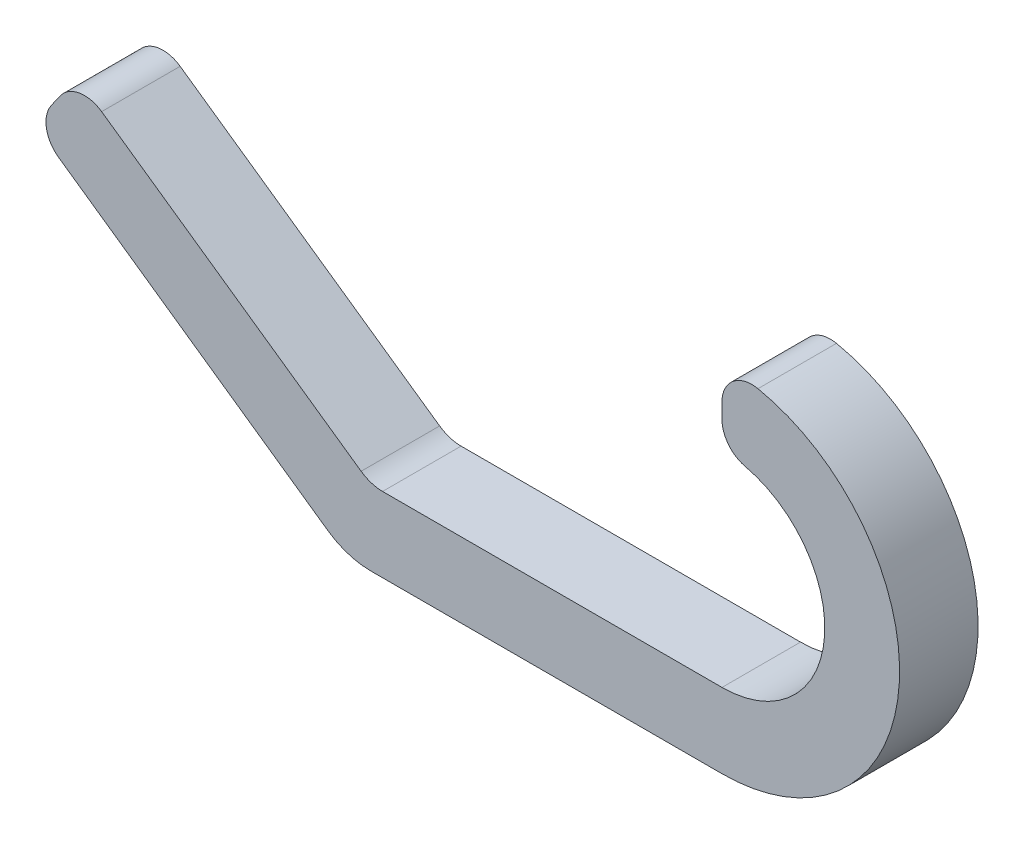
ISO-10303-21;
HEADER;
FILE_DESCRIPTION(('STEP AP214'),'2;1');
FILE_NAME('part.step','',(''),(''),'','','');
FILE_SCHEMA(('AUTOMOTIVE_DESIGN { 1 0 10303 214 1 1 1 1 }'));
ENDSEC;
DATA;
#1=APPLICATION_CONTEXT('core data for automotive mechanical design processes');
#2=APPLICATION_PROTOCOL_DEFINITION('international standard','automotive_design',2000,#1);
#3=PRODUCT_CONTEXT('',#1,'mechanical');
#4=PRODUCT('Part','Part','',(#3));
#5=PRODUCT_RELATED_PRODUCT_CATEGORY('part','',(#4));
#6=PRODUCT_DEFINITION_FORMATION('','',#4);
#7=PRODUCT_DEFINITION_CONTEXT('part definition',#1,'design');
#8=PRODUCT_DEFINITION('design','',#6,#7);
#9=PRODUCT_DEFINITION_SHAPE('','',#8);
#10=(LENGTH_UNIT() NAMED_UNIT(*) SI_UNIT(.MILLI.,.METRE.));
#11=(NAMED_UNIT(*) PLANE_ANGLE_UNIT() SI_UNIT($,.RADIAN.));
#12=(NAMED_UNIT(*) SI_UNIT($,.STERADIAN.) SOLID_ANGLE_UNIT());
#13=UNCERTAINTY_MEASURE_WITH_UNIT(LENGTH_MEASURE(1.E-05),#10,'distance_accuracy_value','');
#14=(GEOMETRIC_REPRESENTATION_CONTEXT(3) GLOBAL_UNCERTAINTY_ASSIGNED_CONTEXT((#13)) GLOBAL_UNIT_ASSIGNED_CONTEXT((#10,
#11,#12)) REPRESENTATION_CONTEXT('',''));
#15=CARTESIAN_POINT('',(0.,0.,0.));
#16=DIRECTION('',(0.,0.,1.));
#17=DIRECTION('',(1.,0.,0.));
#18=AXIS2_PLACEMENT_3D('',#15,#16,#17);
#19=CARTESIAN_POINT('',(93.9518596291826,27.5,21.));
#20=DIRECTION('',(0.,0.,-1.));
#21=DIRECTION('',(-1.,0.,0.));
#22=AXIS2_PLACEMENT_3D('',#19,#20,#21);
#23=CYLINDRICAL_SURFACE('',#22,27.5);
#24=CARTESIAN_POINT('',(93.9518596291826,27.5,21.));
#25=DIRECTION('',(0.,0.,-1.));
#26=DIRECTION('',(1.,0.,0.));
#27=AXIS2_PLACEMENT_3D('',#24,#25,#26);
#28=CIRCLE('',#27,27.5);
#29=CARTESIAN_POINT('',(100.149042727774,54.2926281212302,21.));
#30=VERTEX_POINT('',#29);
#31=CARTESIAN_POINT('',(93.9518596291826,0.,21.));
#32=VERTEX_POINT('',#31);
#33=EDGE_CURVE('E133',#30,#32,#28,.T.);
#34=ORIENTED_EDGE('',*,*,#33,.F.);
#35=DIRECTION('',(0.,0.,-1.));
#36=VECTOR('',#35,1.);
#37=CARTESIAN_POINT('',(100.149042727774,54.2926281212302,21.));
#38=LINE('',#37,#36);
#39=CARTESIAN_POINT('',(100.149042727774,54.2926281212302,0.));
#40=VERTEX_POINT('',#39);
#41=EDGE_CURVE('E154',#30,#40,#38,.T.);
#42=ORIENTED_EDGE('',*,*,#41,.T.);
#43=CARTESIAN_POINT('',(93.9518596291826,27.5,0.));
#44=DIRECTION('',(0.,0.,-1.));
#45=DIRECTION('',(1.,0.,0.));
#46=AXIS2_PLACEMENT_3D('',#43,#44,#45);
#47=CIRCLE('',#46,27.5);
#48=CARTESIAN_POINT('',(93.9518596291826,0.,0.));
#49=VERTEX_POINT('',#48);
#50=EDGE_CURVE('E153',#40,#49,#47,.T.);
#51=ORIENTED_EDGE('',*,*,#50,.T.);
#52=DIRECTION('',(0.,0.,-1.));
#53=VECTOR('',#52,1.);
#54=CARTESIAN_POINT('',(93.9518596291826,0.,21.));
#55=LINE('',#54,#53);
#56=EDGE_CURVE('E149',#32,#49,#55,.T.);
#57=ORIENTED_EDGE('',*,*,#56,.F.);
#58=EDGE_LOOP('',(#34,#42,#51,#57));
#59=FACE_BOUND('',#58,.T.);
#60=ADVANCED_FACE('F33',(#59),#23,.F.);
#61=CARTESIAN_POINT('',(0.,0.,21.));
#62=DIRECTION('',(0.,-1.,0.));
#63=DIRECTION('',(1.,0.,0.));
#64=AXIS2_PLACEMENT_3D('',#61,#62,#63);
#65=PLANE('',#64);
#66=DIRECTION('',(-1.,0.,0.));
#67=VECTOR('',#66,1.);
#68=CARTESIAN_POINT('',(0.,0.,0.));
#69=LINE('',#68,#67);
#70=CARTESIAN_POINT('',(3.1529878887898,0.,0.));
#71=VERTEX_POINT('',#70);
#72=EDGE_CURVE('E220',#49,#71,#69,.T.);
#73=ORIENTED_EDGE('',*,*,#72,.T.);
#74=DIRECTION('',(0.,0.,-1.));
#75=VECTOR('',#74,1.);
#76=CARTESIAN_POINT('',(3.1529878887898,0.,21.));
#77=LINE('',#76,#75);
#78=CARTESIAN_POINT('',(3.1529878887898,0.,21.));
#79=VERTEX_POINT('',#78);
#80=EDGE_CURVE('E48',#71,#79,#77,.F.);
#81=ORIENTED_EDGE('',*,*,#80,.T.);
#82=DIRECTION('',(-1.,0.,0.));
#83=VECTOR('',#82,1.);
#84=CARTESIAN_POINT('',(0.,0.,21.));
#85=LINE('',#84,#83);
#86=EDGE_CURVE('E136',#32,#79,#85,.T.);
#87=ORIENTED_EDGE('',*,*,#86,.F.);
#88=ORIENTED_EDGE('',*,*,#56,.T.);
#89=EDGE_LOOP('',(#73,#81,#87,#88));
#90=FACE_BOUND('',#89,.T.);
#91=ADVANCED_FACE('F148',(#90),#65,.F.);
#92=CARTESIAN_POINT('',(0.,0.,21.));
#93=DIRECTION('',(-0.573576436351041,-0.819152044288996,0.));
#94=DIRECTION('',(0.819152044288996,-0.573576436351041,0.));
#95=AXIS2_PLACEMENT_3D('',#92,#93,#94);
#96=PLANE('',#95);
#97=DIRECTION('',(-0.819152044288995,0.573576436351041,0.));
#98=VECTOR('',#97,1.);
#99=CARTESIAN_POINT('',(0.,0.,21.));
#100=LINE('',#99,#98);
#101=CARTESIAN_POINT('',(-2.5827764747206,1.80847955711004,21.));
#102=VERTEX_POINT('',#101);
#103=CARTESIAN_POINT('',(-71.9949240165054,50.4113885091917,21.));
#104=VERTEX_POINT('',#103);
#105=EDGE_CURVE('E150',#102,#104,#100,.T.);
#106=ORIENTED_EDGE('',*,*,#105,.F.);
#107=DIRECTION('',(0.,0.,-1.));
#108=VECTOR('',#107,1.);
#109=CARTESIAN_POINT('',(-2.58277647472061,1.80847955711004,0.));
#110=LINE('',#109,#108);
#111=CARTESIAN_POINT('',(-2.5827764747206,1.80847955711004,0.));
#112=VERTEX_POINT('',#111);
#113=EDGE_CURVE('E206',#102,#112,#110,.T.);
#114=ORIENTED_EDGE('',*,*,#113,.T.);
#115=DIRECTION('',(-0.819152044288995,0.573576436351041,0.));
#116=VECTOR('',#115,1.);
#117=CARTESIAN_POINT('',(0.,0.,0.));
#118=LINE('',#117,#116);
#119=CARTESIAN_POINT('',(-71.9949240165054,50.4113885091917,0.));
#120=VERTEX_POINT('',#119);
#121=EDGE_CURVE('E213',#112,#120,#118,.T.);
#122=ORIENTED_EDGE('',*,*,#121,.T.);
#123=DIRECTION('',(0.,0.,-1.));
#124=VECTOR('',#123,1.);
#125=CARTESIAN_POINT('',(-71.9949240165055,50.4113885091917,21.));
#126=LINE('',#125,#124);
#127=EDGE_CURVE('E194',#120,#104,#126,.F.);
#128=ORIENTED_EDGE('',*,*,#127,.T.);
#129=EDGE_LOOP('',(#106,#114,#122,#128));
#130=FACE_BOUND('',#129,.T.);
#131=ADVANCED_FACE('F212',(#130),#96,.F.);
#132=CARTESIAN_POINT('',(-90.0196690978382,38.6169591142201,21.));
#133=DIRECTION('',(0.819152044288995,-0.573576436351041,0.));
#134=DIRECTION('',(0.573576436351041,0.819152044288995,0.));
#135=AXIS2_PLACEMENT_3D('',#132,#133,#134);
#136=PLANE('',#135);
#137=DIRECTION('',(-0.573576436351041,-0.819152044288995,0.));
#138=VECTOR('',#137,1.);
#139=CARTESIAN_POINT('',(-90.0196690978382,38.6169591142201,0.));
#140=LINE('',#139,#138);
#141=CARTESIAN_POINT('',(-83.1367518616257,48.446783645688,0.));
#142=VERTEX_POINT('',#141);
#143=CARTESIAN_POINT('',(-85.4310576070299,45.1701754685321,0.));
#144=VERTEX_POINT('',#143);
#145=EDGE_CURVE('E219',#142,#144,#140,.T.);
#146=ORIENTED_EDGE('',*,*,#145,.T.);
#147=DIRECTION('',(0.,0.,-1.));
#148=VECTOR('',#147,1.);
#149=CARTESIAN_POINT('',(-85.4310576070299,45.1701754685321,21.));
#150=LINE('',#149,#148);
#151=CARTESIAN_POINT('',(-85.4310576070299,45.1701754685321,21.));
#152=VERTEX_POINT('',#151);
#153=EDGE_CURVE('E192',#144,#152,#150,.F.);
#154=ORIENTED_EDGE('',*,*,#153,.T.);
#155=DIRECTION('',(-0.573576436351041,-0.819152044288995,0.));
#156=VECTOR('',#155,1.);
#157=CARTESIAN_POINT('',(-90.0196690978382,38.6169591142201,21.));
#158=LINE('',#157,#156);
#159=CARTESIAN_POINT('',(-83.1367518616257,48.446783645688,21.));
#160=VERTEX_POINT('',#159);
#161=EDGE_CURVE('E252',#160,#152,#158,.T.);
#162=ORIENTED_EDGE('',*,*,#161,.F.);
#163=DIRECTION('',(0.,0.,-1.));
#164=VECTOR('',#163,1.);
#165=CARTESIAN_POINT('',(-83.1367518616257,48.446783645688,21.));
#166=LINE('',#165,#164);
#167=EDGE_CURVE('E189',#160,#142,#166,.T.);
#168=ORIENTED_EDGE('',*,*,#167,.T.);
#169=EDGE_LOOP('',(#146,#154,#162,#168));
#170=FACE_BOUND('',#169,.T.);
#171=ADVANCED_FACE('F261',(#170),#136,.F.);
#172=CARTESIAN_POINT('',(-6.3059757775796,-20.,21.));
#173=DIRECTION('',(0.573576436351041,0.819152044288996,0.));
#174=DIRECTION('',(-0.819152044288996,0.573576436351041,0.));
#175=AXIS2_PLACEMENT_3D('',#172,#173,#174);
#176=PLANE('',#175);
#177=DIRECTION('',(0.819152044288996,-0.573576436351041,0.));
#178=VECTOR('',#177,1.);
#179=CARTESIAN_POINT('',(-6.3059757775796,-20.,0.));
#180=LINE('',#179,#178);
#181=CARTESIAN_POINT('',(-83.4664527435262,34.0283476234118,0.));
#182=VERTEX_POINT('',#181);
#183=CARTESIAN_POINT('',(-11.4715287270208,-16.3830408857799,0.));
#184=VERTEX_POINT('',#183);
#185=EDGE_CURVE('E223',#182,#184,#180,.T.);
#186=ORIENTED_EDGE('',*,*,#185,.T.);
#187=DIRECTION('',(0.,0.,-1.));
#188=VECTOR('',#187,1.);
#189=CARTESIAN_POINT('',(-11.4715287270208,-16.3830408857799,21.));
#190=LINE('',#189,#188);
#191=CARTESIAN_POINT('',(-11.4715287270208,-16.3830408857799,21.));
#192=VERTEX_POINT('',#191);
#193=EDGE_CURVE('E202',#184,#192,#190,.F.);
#194=ORIENTED_EDGE('',*,*,#193,.T.);
#195=DIRECTION('',(0.819152044288996,-0.573576436351041,0.));
#196=VECTOR('',#195,1.);
#197=CARTESIAN_POINT('',(-6.3059757775796,-20.,21.));
#198=LINE('',#197,#196);
#199=CARTESIAN_POINT('',(-83.4664527435262,34.0283476234118,21.));
#200=VERTEX_POINT('',#199);
#201=EDGE_CURVE('E250',#200,#192,#198,.T.);
#202=ORIENTED_EDGE('',*,*,#201,.F.);
#203=DIRECTION('',(0.,0.,-1.));
#204=VECTOR('',#203,1.);
#205=CARTESIAN_POINT('',(-83.4664527435262,34.0283476234118,21.));
#206=LINE('',#205,#204);
#207=EDGE_CURVE('E186',#200,#182,#206,.T.);
#208=ORIENTED_EDGE('',*,*,#207,.T.);
#209=EDGE_LOOP('',(#186,#194,#202,#208));
#210=FACE_BOUND('',#209,.T.);
#211=ADVANCED_FACE('F270',(#210),#176,.F.);
#212=CARTESIAN_POINT('',(-6.3059757775796,-20.,21.));
#213=DIRECTION('',(0.,1.,0.));
#214=DIRECTION('',(-1.,0.,0.));
#215=AXIS2_PLACEMENT_3D('',#212,#213,#214);
#216=PLANE('',#215);
#217=DIRECTION('',(1.,0.,0.));
#218=VECTOR('',#217,1.);
#219=CARTESIAN_POINT('',(-6.3059757775796,-20.,21.));
#220=LINE('',#219,#218);
#221=CARTESIAN_POINT('',(0.,-20.,21.));
#222=VERTEX_POINT('',#221);
#223=CARTESIAN_POINT('',(93.9518596291826,-20.,21.));
#224=VERTEX_POINT('',#223);
#225=EDGE_CURVE('E248',#222,#224,#220,.T.);
#226=ORIENTED_EDGE('',*,*,#225,.F.);
#227=DIRECTION('',(0.,0.,-1.));
#228=VECTOR('',#227,1.);
#229=CARTESIAN_POINT('',(0.,-20.,21.));
#230=LINE('',#229,#228);
#231=CARTESIAN_POINT('',(0.,-20.,0.));
#232=VERTEX_POINT('',#231);
#233=EDGE_CURVE('E197',#222,#232,#230,.T.);
#234=ORIENTED_EDGE('',*,*,#233,.T.);
#235=DIRECTION('',(1.,0.,0.));
#236=VECTOR('',#235,1.);
#237=CARTESIAN_POINT('',(-6.3059757775796,-20.,0.));
#238=LINE('',#237,#236);
#239=CARTESIAN_POINT('',(93.9518596291826,-20.,0.));
#240=VERTEX_POINT('',#239);
#241=EDGE_CURVE('E230',#232,#240,#238,.T.);
#242=ORIENTED_EDGE('',*,*,#241,.T.);
#243=DIRECTION('',(0.,0.,-1.));
#244=VECTOR('',#243,1.);
#245=CARTESIAN_POINT('',(93.9518596291826,-20.,21.));
#246=LINE('',#245,#244);
#247=EDGE_CURVE('E155',#224,#240,#246,.T.);
#248=ORIENTED_EDGE('',*,*,#247,.F.);
#249=EDGE_LOOP('',(#226,#234,#242,#248));
#250=FACE_BOUND('',#249,.T.);
#251=ADVANCED_FACE('F278',(#250),#216,.F.);
#252=CARTESIAN_POINT('',(93.9518596291826,27.5,21.));
#253=DIRECTION('',(0.,0.,-1.));
#254=DIRECTION('',(-1.,0.,0.));
#255=AXIS2_PLACEMENT_3D('',#252,#253,#254);
#256=CYLINDRICAL_SURFACE('',#255,47.5);
#257=CARTESIAN_POINT('',(93.9518596291826,27.5,0.));
#258=DIRECTION('',(0.,0.,1.));
#259=DIRECTION('',(1.,0.,0.));
#260=AXIS2_PLACEMENT_3D('',#257,#258,#259);
#261=CIRCLE('',#260,47.5);
#262=CARTESIAN_POINT('',(103.57211279374,74.0155966214542,0.));
#263=VERTEX_POINT('',#262);
#264=EDGE_CURVE('E232',#240,#263,#261,.T.);
#265=ORIENTED_EDGE('',*,*,#264,.T.);
#266=DIRECTION('',(0.,0.,-1.));
#267=VECTOR('',#266,1.);
#268=CARTESIAN_POINT('',(103.57211279374,74.0155966214542,21.));
#269=LINE('',#268,#267);
#270=CARTESIAN_POINT('',(103.57211279374,74.0155966214542,21.));
#271=VERTEX_POINT('',#270);
#272=EDGE_CURVE('E184',#263,#271,#269,.F.);
#273=ORIENTED_EDGE('',*,*,#272,.T.);
#274=CARTESIAN_POINT('',(93.9518596291826,27.5,21.));
#275=DIRECTION('',(0.,0.,1.));
#276=DIRECTION('',(1.,0.,0.));
#277=AXIS2_PLACEMENT_3D('',#274,#275,#276);
#278=CIRCLE('',#277,47.5);
#279=EDGE_CURVE('E245',#224,#271,#278,.T.);
#280=ORIENTED_EDGE('',*,*,#279,.F.);
#281=ORIENTED_EDGE('',*,*,#247,.T.);
#282=EDGE_LOOP('',(#265,#273,#280,#281));
#283=FACE_BOUND('',#282,.T.);
#284=ADVANCED_FACE('F283',(#283),#256,.T.);
#285=CARTESIAN_POINT('',(93.9518596291826,75.0000000000001,21.));
#286=DIRECTION('',(1.,0.,0.));
#287=DIRECTION('',(0.,0.,-1.));
#288=AXIS2_PLACEMENT_3D('',#285,#286,#287);
#289=PLANE('',#288);
#290=DIRECTION('',(0.,-1.,0.));
#291=VECTOR('',#290,1.);
#292=CARTESIAN_POINT('',(93.9518596291826,75.0000000000001,0.));
#293=LINE('',#292,#291);
#294=CARTESIAN_POINT('',(93.9518596291826,66.1813908746829,0.));
#295=VERTEX_POINT('',#294);
#296=CARTESIAN_POINT('',(93.9518596291826,62.0868472110426,0.));
#297=VERTEX_POINT('',#296);
#298=EDGE_CURVE('E145',#295,#297,#293,.T.);
#299=ORIENTED_EDGE('',*,*,#298,.T.);
#300=DIRECTION('',(0.,0.,-1.));
#301=VECTOR('',#300,1.);
#302=CARTESIAN_POINT('',(93.9518596291826,62.0868472110426,21.));
#303=LINE('',#302,#301);
#304=CARTESIAN_POINT('',(93.9518596291826,62.0868472110426,21.));
#305=VERTEX_POINT('',#304);
#306=EDGE_CURVE('E175',#297,#305,#303,.F.);
#307=ORIENTED_EDGE('',*,*,#306,.T.);
#308=DIRECTION('',(0.,-1.,0.));
#309=VECTOR('',#308,1.);
#310=CARTESIAN_POINT('',(93.9518596291826,75.0000000000001,21.));
#311=LINE('',#310,#309);
#312=CARTESIAN_POINT('',(93.9518596291826,66.1813908746829,21.));
#313=VERTEX_POINT('',#312);
#314=EDGE_CURVE('E160',#313,#305,#311,.T.);
#315=ORIENTED_EDGE('',*,*,#314,.F.);
#316=DIRECTION('',(0.,0.,-1.));
#317=VECTOR('',#316,1.);
#318=CARTESIAN_POINT('',(93.9518596291826,66.1813908746829,21.));
#319=LINE('',#318,#317);
#320=EDGE_CURVE('E172',#313,#295,#319,.T.);
#321=ORIENTED_EDGE('',*,*,#320,.T.);
#322=EDGE_LOOP('',(#299,#307,#315,#321));
#323=FACE_BOUND('',#322,.T.);
#324=ADVANCED_FACE('F238',(#323),#289,.F.);
#325=CARTESIAN_POINT('',(93.9518596291826,27.5,21.));
#326=DIRECTION('',(0.,0.,1.));
#327=DIRECTION('',(1.,0.,0.));
#328=AXIS2_PLACEMENT_3D('',#325,#326,#327);
#329=PLANE('',#328);
#330=ORIENTED_EDGE('',*,*,#201,.T.);
#331=CARTESIAN_POINT('',(0.,0.,21.));
#332=DIRECTION('',(0.,0.,1.));
#333=DIRECTION('',(1.,0.,0.));
#334=AXIS2_PLACEMENT_3D('',#331,#332,#333);
#335=CIRCLE('',#334,20.);
#336=EDGE_CURVE('E204',#192,#222,#335,.T.);
#337=ORIENTED_EDGE('',*,*,#336,.T.);
#338=ORIENTED_EDGE('',*,*,#225,.T.);
#339=ORIENTED_EDGE('',*,*,#279,.T.);
#340=CARTESIAN_POINT('',(101.951859629183,66.1813908746829,21.));
#341=DIRECTION('',(0.,0.,1.));
#342=DIRECTION('',(1.,0.,0.));
#343=AXIS2_PLACEMENT_3D('',#340,#341,#342);
#344=CIRCLE('',#343,8.);
#345=EDGE_CURVE('E181',#271,#313,#344,.T.);
#346=ORIENTED_EDGE('',*,*,#345,.T.);
#347=ORIENTED_EDGE('',*,*,#314,.T.);
#348=CARTESIAN_POINT('',(101.951859629183,62.0868472110426,21.));
#349=DIRECTION('',(0.,0.,1.));
#350=DIRECTION('',(1.,0.,0.));
#351=AXIS2_PLACEMENT_3D('',#348,#349,#350);
#352=CIRCLE('',#351,8.);
#353=EDGE_CURVE('E140',#305,#30,#352,.T.);
#354=ORIENTED_EDGE('',*,*,#353,.T.);
#355=ORIENTED_EDGE('',*,*,#33,.T.);
#356=ORIENTED_EDGE('',*,*,#86,.T.);
#357=CARTESIAN_POINT('',(3.1529878887898,10.,21.));
#358=DIRECTION('',(0.,0.,1.));
#359=DIRECTION('',(1.,0.,0.));
#360=AXIS2_PLACEMENT_3D('',#357,#358,#359);
#361=CIRCLE('',#360,10.);
#362=EDGE_CURVE('E11',#79,#102,#361,.F.);
#363=ORIENTED_EDGE('',*,*,#362,.T.);
#364=ORIENTED_EDGE('',*,*,#105,.T.);
#365=CARTESIAN_POINT('',(-76.5835355073138,43.8581721548797,21.));
#366=DIRECTION('',(0.,0.,1.));
#367=DIRECTION('',(1.,0.,0.));
#368=AXIS2_PLACEMENT_3D('',#365,#366,#367);
#369=CIRCLE('',#368,8.);
#370=EDGE_CURVE('E177',#104,#160,#369,.T.);
#371=ORIENTED_EDGE('',*,*,#370,.T.);
#372=ORIENTED_EDGE('',*,*,#161,.T.);
#373=CARTESIAN_POINT('',(-78.8778412527179,40.5815639777237,21.));
#374=DIRECTION('',(0.,0.,1.));
#375=DIRECTION('',(1.,0.,0.));
#376=AXIS2_PLACEMENT_3D('',#373,#374,#375);
#377=CIRCLE('',#376,8.);
#378=EDGE_CURVE('E179',#152,#200,#377,.T.);
#379=ORIENTED_EDGE('',*,*,#378,.T.);
#380=EDGE_LOOP('',(#330,#337,#338,#339,#346,#347,#354,#355,#356,#363,#364,#371,#372,#379));
#381=FACE_BOUND('',#380,.T.);
#382=ADVANCED_FACE('F135',(#381),#329,.T.);
#383=CARTESIAN_POINT('',(93.9518596291826,27.5,0.));
#384=DIRECTION('',(0.,0.,1.));
#385=DIRECTION('',(1.,0.,0.));
#386=AXIS2_PLACEMENT_3D('',#383,#384,#385);
#387=PLANE('',#386);
#388=ORIENTED_EDGE('',*,*,#241,.F.);
#389=CARTESIAN_POINT('',(0.,0.,0.));
#390=DIRECTION('',(0.,0.,1.));
#391=DIRECTION('',(1.,0.,0.));
#392=AXIS2_PLACEMENT_3D('',#389,#390,#391);
#393=CIRCLE('',#392,20.);
#394=EDGE_CURVE('E200',#232,#184,#393,.F.);
#395=ORIENTED_EDGE('',*,*,#394,.T.);
#396=ORIENTED_EDGE('',*,*,#185,.F.);
#397=CARTESIAN_POINT('',(-78.8778412527179,40.5815639777237,0.));
#398=DIRECTION('',(0.,0.,1.));
#399=DIRECTION('',(1.,0.,0.));
#400=AXIS2_PLACEMENT_3D('',#397,#398,#399);
#401=CIRCLE('',#400,8.);
#402=EDGE_CURVE('E166',#182,#144,#401,.F.);
#403=ORIENTED_EDGE('',*,*,#402,.T.);
#404=ORIENTED_EDGE('',*,*,#145,.F.);
#405=CARTESIAN_POINT('',(-76.5835355073138,43.8581721548797,0.));
#406=DIRECTION('',(0.,0.,1.));
#407=DIRECTION('',(1.,0.,0.));
#408=AXIS2_PLACEMENT_3D('',#405,#406,#407);
#409=CIRCLE('',#408,8.);
#410=EDGE_CURVE('E157',#142,#120,#409,.F.);
#411=ORIENTED_EDGE('',*,*,#410,.T.);
#412=ORIENTED_EDGE('',*,*,#121,.F.);
#413=CARTESIAN_POINT('',(3.1529878887898,10.,0.));
#414=DIRECTION('',(0.,0.,1.));
#415=DIRECTION('',(1.,0.,0.));
#416=AXIS2_PLACEMENT_3D('',#413,#414,#415);
#417=CIRCLE('',#416,10.);
#418=EDGE_CURVE('E41',#112,#71,#417,.T.);
#419=ORIENTED_EDGE('',*,*,#418,.T.);
#420=ORIENTED_EDGE('',*,*,#72,.F.);
#421=ORIENTED_EDGE('',*,*,#50,.F.);
#422=CARTESIAN_POINT('',(101.951859629183,62.0868472110426,0.));
#423=DIRECTION('',(0.,0.,1.));
#424=DIRECTION('',(1.,0.,0.));
#425=AXIS2_PLACEMENT_3D('',#422,#423,#424);
#426=CIRCLE('',#425,8.);
#427=EDGE_CURVE('E170',#40,#297,#426,.F.);
#428=ORIENTED_EDGE('',*,*,#427,.T.);
#429=ORIENTED_EDGE('',*,*,#298,.F.);
#430=CARTESIAN_POINT('',(101.951859629183,66.1813908746829,0.));
#431=DIRECTION('',(0.,0.,1.));
#432=DIRECTION('',(1.,0.,0.));
#433=AXIS2_PLACEMENT_3D('',#430,#431,#432);
#434=CIRCLE('',#433,8.);
#435=EDGE_CURVE('E168',#295,#263,#434,.F.);
#436=ORIENTED_EDGE('',*,*,#435,.T.);
#437=ORIENTED_EDGE('',*,*,#264,.F.);
#438=EDGE_LOOP('',(#388,#395,#396,#403,#404,#411,#412,#419,#420,#421,#428,#429,#436,#437));
#439=FACE_BOUND('',#438,.T.);
#440=ADVANCED_FACE('F216',(#439),#387,.F.);
#441=CARTESIAN_POINT('',(101.951859629183,62.0868472110426,21.));
#442=DIRECTION('',(0.,0.,-1.));
#443=DIRECTION('',(-1.,0.,0.));
#444=AXIS2_PLACEMENT_3D('',#441,#442,#443);
#445=CYLINDRICAL_SURFACE('',#444,8.);
#446=ORIENTED_EDGE('',*,*,#353,.F.);
#447=ORIENTED_EDGE('',*,*,#306,.F.);
#448=ORIENTED_EDGE('',*,*,#427,.F.);
#449=ORIENTED_EDGE('',*,*,#41,.F.);
#450=EDGE_LOOP('',(#446,#447,#448,#449));
#451=FACE_BOUND('',#450,.T.);
#452=ADVANCED_FACE('F242',(#451),#445,.T.);
#453=CARTESIAN_POINT('',(101.951859629183,66.1813908746829,21.));
#454=DIRECTION('',(0.,0.,-1.));
#455=DIRECTION('',(-1.,0.,0.));
#456=AXIS2_PLACEMENT_3D('',#453,#454,#455);
#457=CYLINDRICAL_SURFACE('',#456,8.);
#458=ORIENTED_EDGE('',*,*,#345,.F.);
#459=ORIENTED_EDGE('',*,*,#272,.F.);
#460=ORIENTED_EDGE('',*,*,#435,.F.);
#461=ORIENTED_EDGE('',*,*,#320,.F.);
#462=EDGE_LOOP('',(#458,#459,#460,#461));
#463=FACE_BOUND('',#462,.T.);
#464=ADVANCED_FACE('F287',(#463),#457,.T.);
#465=CARTESIAN_POINT('',(-78.8778412527179,40.5815639777237,21.));
#466=DIRECTION('',(0.,0.,-1.));
#467=DIRECTION('',(-1.,0.,0.));
#468=AXIS2_PLACEMENT_3D('',#465,#466,#467);
#469=CYLINDRICAL_SURFACE('',#468,8.);
#470=ORIENTED_EDGE('',*,*,#378,.F.);
#471=ORIENTED_EDGE('',*,*,#153,.F.);
#472=ORIENTED_EDGE('',*,*,#402,.F.);
#473=ORIENTED_EDGE('',*,*,#207,.F.);
#474=EDGE_LOOP('',(#470,#471,#472,#473));
#475=FACE_BOUND('',#474,.T.);
#476=ADVANCED_FACE('F267',(#475),#469,.T.);
#477=CARTESIAN_POINT('',(-76.5835355073138,43.8581721548797,21.));
#478=DIRECTION('',(0.,0.,-1.));
#479=DIRECTION('',(-1.,0.,0.));
#480=AXIS2_PLACEMENT_3D('',#477,#478,#479);
#481=CYLINDRICAL_SURFACE('',#480,8.);
#482=ORIENTED_EDGE('',*,*,#370,.F.);
#483=ORIENTED_EDGE('',*,*,#127,.F.);
#484=ORIENTED_EDGE('',*,*,#410,.F.);
#485=ORIENTED_EDGE('',*,*,#167,.F.);
#486=EDGE_LOOP('',(#482,#483,#484,#485));
#487=FACE_BOUND('',#486,.T.);
#488=ADVANCED_FACE('F259',(#487),#481,.T.);
#489=CARTESIAN_POINT('',(0.,0.,21.));
#490=DIRECTION('',(0.,0.,-1.));
#491=DIRECTION('',(-1.,0.,0.));
#492=AXIS2_PLACEMENT_3D('',#489,#490,#491);
#493=CYLINDRICAL_SURFACE('',#492,20.);
#494=ORIENTED_EDGE('',*,*,#336,.F.);
#495=ORIENTED_EDGE('',*,*,#193,.F.);
#496=ORIENTED_EDGE('',*,*,#394,.F.);
#497=ORIENTED_EDGE('',*,*,#233,.F.);
#498=EDGE_LOOP('',(#494,#495,#496,#497));
#499=FACE_BOUND('',#498,.T.);
#500=ADVANCED_FACE('F276',(#499),#493,.T.);
#501=CARTESIAN_POINT('',(3.1529878887898,10.,21.));
#502=DIRECTION('',(0.,0.,1.));
#503=DIRECTION('',(1.,0.,0.));
#504=AXIS2_PLACEMENT_3D('',#501,#502,#503);
#505=CYLINDRICAL_SURFACE('',#504,10.);
#506=ORIENTED_EDGE('',*,*,#362,.F.);
#507=ORIENTED_EDGE('',*,*,#80,.F.);
#508=ORIENTED_EDGE('',*,*,#418,.F.);
#509=ORIENTED_EDGE('',*,*,#113,.F.);
#510=EDGE_LOOP('',(#506,#507,#508,#509));
#511=FACE_BOUND('',#510,.T.);
#512=ADVANCED_FACE('F35',(#511),#505,.F.);
#513=CLOSED_SHELL('',(#60,#91,#131,#171,#211,#251,#284,#324,#382,#440,#452,#464,#476,#488,#500,#512));
#514=MANIFOLD_SOLID_BREP('B2',#513);
#515=ADVANCED_BREP_SHAPE_REPRESENTATION('',(#18,#514),#14);
#516=SHAPE_DEFINITION_REPRESENTATION(#9,#515);
ENDSEC;
END-ISO-10303-21;
